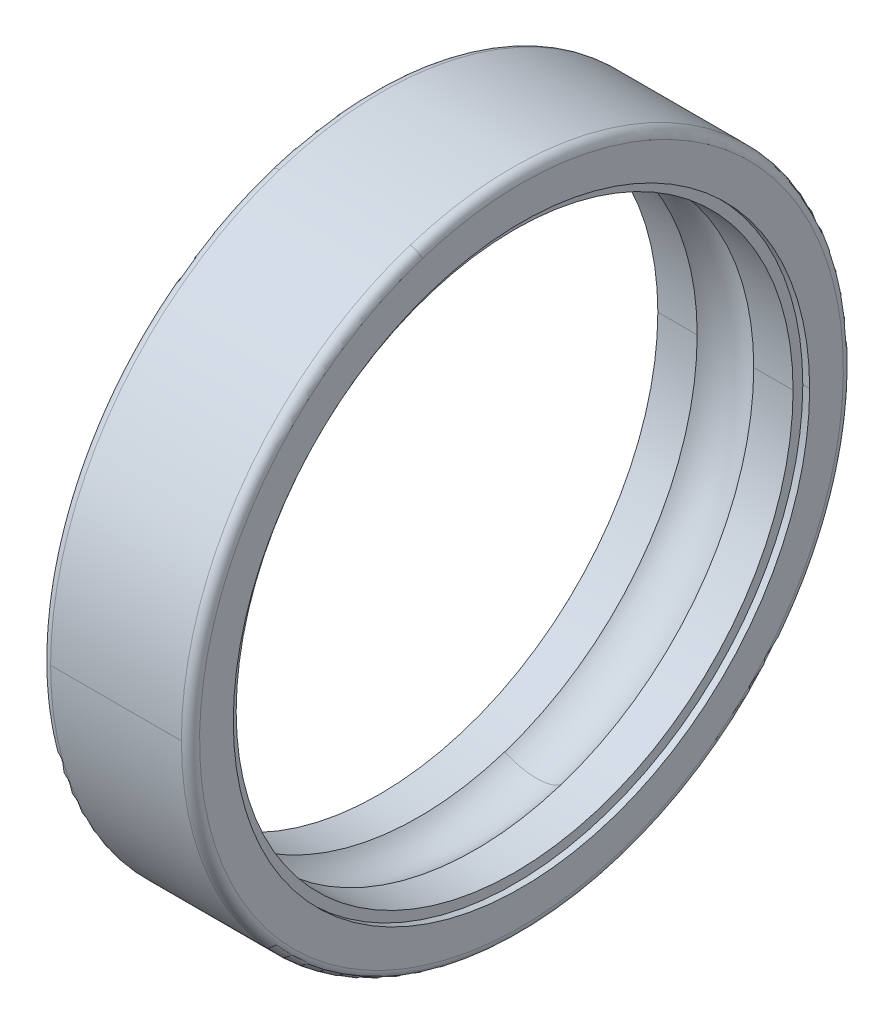
ISO-10303-21;
HEADER;
FILE_DESCRIPTION(('STEP AP214'),'2;1');
FILE_NAME('part.step','',(''),(''),'','','');
FILE_SCHEMA(('AUTOMOTIVE_DESIGN { 1 0 10303 214 1 1 1 1 }'));
ENDSEC;
DATA;
#1=APPLICATION_CONTEXT('core data for automotive mechanical design processes');
#2=APPLICATION_PROTOCOL_DEFINITION('international standard','automotive_design',2000,#1);
#3=PRODUCT_CONTEXT('',#1,'mechanical');
#4=PRODUCT('Part','Part','',(#3));
#5=PRODUCT_RELATED_PRODUCT_CATEGORY('part','',(#4));
#6=PRODUCT_DEFINITION_FORMATION('','',#4);
#7=PRODUCT_DEFINITION_CONTEXT('part definition',#1,'design');
#8=PRODUCT_DEFINITION('design','',#6,#7);
#9=PRODUCT_DEFINITION_SHAPE('','',#8);
#10=(LENGTH_UNIT() NAMED_UNIT(*) SI_UNIT(.MILLI.,.METRE.));
#11=(NAMED_UNIT(*) PLANE_ANGLE_UNIT() SI_UNIT($,.RADIAN.));
#12=(NAMED_UNIT(*) SI_UNIT($,.STERADIAN.) SOLID_ANGLE_UNIT());
#13=UNCERTAINTY_MEASURE_WITH_UNIT(LENGTH_MEASURE(1.E-05),#10,'distance_accuracy_value','');
#14=(GEOMETRIC_REPRESENTATION_CONTEXT(3) GLOBAL_UNCERTAINTY_ASSIGNED_CONTEXT((#13)) GLOBAL_UNIT_ASSIGNED_CONTEXT((#10,
#11,#12)) REPRESENTATION_CONTEXT('',''));
#15=CARTESIAN_POINT('',(0.,0.,0.));
#16=DIRECTION('',(0.,0.,1.));
#17=DIRECTION('',(1.,0.,0.));
#18=AXIS2_PLACEMENT_3D('',#15,#16,#17);
#19=CARTESIAN_POINT('',(0.,38.9,0.));
#20=DIRECTION('',(-1.,0.,0.));
#21=DIRECTION('',(0.,0.,1.));
#22=AXIS2_PLACEMENT_3D('',#19,#20,#21);
#23=PLANE('',#22);
#24=CARTESIAN_POINT('',(0.,0.,0.));
#25=DIRECTION('',(1.,0.,0.));
#26=DIRECTION('',(0.,0.,-1.));
#27=AXIS2_PLACEMENT_3D('',#24,#25,#26);
#28=CIRCLE('',#27,34.825);
#29=CARTESIAN_POINT('',(0.,0.,-34.825));
#30=VERTEX_POINT('',#29);
#31=CARTESIAN_POINT('',(0.,0.,34.825));
#32=VERTEX_POINT('',#31);
#33=EDGE_CURVE('E10',#30,#32,#28,.T.);
#34=ORIENTED_EDGE('',*,*,#33,.T.);
#35=CARTESIAN_POINT('',(0.,0.,0.));
#36=DIRECTION('',(1.,0.,0.));
#37=DIRECTION('',(0.,0.,-1.));
#38=AXIS2_PLACEMENT_3D('',#35,#36,#37);
#39=CIRCLE('',#38,34.825);
#40=EDGE_CURVE('E25',#32,#30,#39,.T.);
#41=ORIENTED_EDGE('',*,*,#40,.T.);
#42=EDGE_LOOP('',(#34,#41));
#43=FACE_BOUND('',#42,.T.);
#44=CARTESIAN_POINT('',(0.,36.9960984838815,12.0207610811854));
#45=CARTESIAN_POINT('',(0.,36.7994218829417,12.626113110637));
#46=CARTESIAN_POINT('',(0.,36.5878629555731,13.2266283711158));
#47=CARTESIAN_POINT('',(0.,36.1355455906681,14.4165597485006));
#48=CARTESIAN_POINT('',(0.,35.8947871531317,15.0059758654065));
#49=CARTESIAN_POINT('',(0.,35.3846359105815,16.1722833500178));
#50=CARTESIAN_POINT('',(0.,35.1152431055675,16.7491747177233));
#51=CARTESIAN_POINT('',(0.,34.5484761021171,17.8890444361661));
#52=CARTESIAN_POINT('',(0.,34.2511019036806,18.4520227869036));
#53=CARTESIAN_POINT('',(0.,33.629087446583,19.5627098015595));
#54=CARTESIAN_POINT('',(0.,33.3044471879219,20.1104184654779));
#55=CARTESIAN_POINT('',(0.,32.6286829831736,21.1892467370559));
#56=CARTESIAN_POINT('',(0.,32.2775590370864,21.7203663447154));
#57=CARTESIAN_POINT('',(0.,31.5496732691986,22.7647369609928));
#58=CARTESIAN_POINT('',(0.,31.1729114473981,23.2779879696105));
#59=CARTESIAN_POINT('',(0.,30.3946576008453,24.2853849289737));
#60=CARTESIAN_POINT('',(0.,29.9931655760931,24.7795308797192));
#61=CARTESIAN_POINT('',(0.,29.1664185475894,25.7475272803691));
#62=CARTESIAN_POINT('',(0.,28.7411635438379,26.2213777302735));
#63=CARTESIAN_POINT('',(0.,27.867915035362,27.1476415825635));
#64=CARTESIAN_POINT('',(0.,27.4199215306375,27.600054984949));
#65=CARTESIAN_POINT('',(0.,26.502275275413,28.482354838538));
#66=CARTESIAN_POINT('',(0.,26.0326225249129,28.9122412897415));
#67=CARTESIAN_POINT('',(0.,25.0727892128557,29.7484516068919));
#68=CARTESIAN_POINT('',(0.,24.5826086512986,30.154775472839));
#69=CARTESIAN_POINT('',(0.,23.5829006050065,30.942881749683));
#70=CARTESIAN_POINT('',(0.,23.0733731202715,31.3246641605799));
#71=CARTESIAN_POINT('',(0.,22.0361987239713,32.0627677800587));
#72=CARTESIAN_POINT('',(0.,21.5085518124061,32.4190889886405));
#73=CARTESIAN_POINT('',(0.,20.4364097100698,33.1054117944866));
#74=CARTESIAN_POINT('',(0.,19.8919145192987,33.4354133917509));
#75=CARTESIAN_POINT('',(0.,18.7873875951579,34.0683019722096));
#76=CARTESIAN_POINT('',(0.,18.2273558617882,34.3711889554041));
#77=CARTESIAN_POINT('',(0.,17.0931050179486,34.9491186264509));
#78=CARTESIAN_POINT('',(0.,16.5188859074788,35.2241613143032));
#79=CARTESIAN_POINT('',(0.,15.3576436535719,35.7457397927398));
#80=CARTESIAN_POINT('',(0.,14.7706205101348,35.992275583324));
#81=CARTESIAN_POINT('',(0.,13.5851843804631,36.4562463409109));
#82=CARTESIAN_POINT('',(0.,12.9867713942284,36.6736813079135));
#83=CARTESIAN_POINT('',(0.,11.77999720826,37.0789265984567));
#84=CARTESIAN_POINT('',(0.,11.1716360085264,37.2667369219972));
#85=CARTESIAN_POINT('',(0.,9.94643099097645,37.6122804740965));
#86=CARTESIAN_POINT('',(0.,9.32958717316014,37.7700137026552));
#87=CARTESIAN_POINT('',(0.,8.08890295023112,38.0550230716275));
#88=CARTESIAN_POINT('',(0.,7.46506254511841,38.182299212041));
#89=CARTESIAN_POINT('',(0.,6.21188803377446,38.4060877853526));
#90=CARTESIAN_POINT('',(0.,5.58255392754323,38.5026002182506));
#91=CARTESIAN_POINT('',(0.,4.31990813494732,38.6646288696267));
#92=CARTESIAN_POINT('',(0.,3.68659644858263,38.7301450881049));
#93=CARTESIAN_POINT('',(0.,2.41752119904381,38.8300234763325));
#94=CARTESIAN_POINT('',(0.,1.78175763586968,38.8643856460819));
#95=CARTESIAN_POINT('',(0.,0.509310242821964,38.9018731553754));
#96=CARTESIAN_POINT('',(0.,-0.127373587051612,38.9049984949194));
#97=CARTESIAN_POINT('',(0.,-1.40012768638514,38.8800048145853));
#98=CARTESIAN_POINT('',(0.,-2.0361979558451,38.8518857947072));
#99=CARTESIAN_POINT('',(0.,-3.30619258535906,38.7644711367107));
#100=CARTESIAN_POINT('',(0.,-3.94011694541307,38.7051754985922));
#101=CARTESIAN_POINT('',(0.,-5.20429257680657,38.555550452501));
#102=CARTESIAN_POINT('',(0.,-5.83454384814606,38.4652210445282));
#103=CARTESIAN_POINT('',(0.,-7.08985497159437,38.253746070184));
#104=CARTESIAN_POINT('',(0.,-7.71491482370319,38.1326005038125));
#105=CARTESIAN_POINT('',(0.,-8.95833728475763,37.8597850629514));
#106=CARTESIAN_POINT('',(0.,-9.57669989370326,37.7081151884618));
#107=CARTESIAN_POINT('',(0.,-10.8052381787442,37.3746165173767));
#108=CARTESIAN_POINT('',(0.,-11.4154138548396,37.1927877207812));
#109=CARTESIAN_POINT('',(0.,-12.6261083075312,36.7994092469818));
#110=CARTESIAN_POINT('',(0.,-13.2266270841274,36.5878595697778));
#111=CARTESIAN_POINT('',(0.,-14.4165610354888,36.1355489764634));
#112=CARTESIAN_POINT('',(0.,-15.0059762102539,35.8947880603529));
#113=CARTESIAN_POINT('',(0.,-16.1722830051703,35.3846350033604));
#114=CARTESIAN_POINT('',(0.,-16.7491746253216,35.1152428624784));
#115=CARTESIAN_POINT('',(0.,-17.8890445285677,34.5484763452063));
#116=CARTESIAN_POINT('',(0.,-18.4520228116625,34.2511019688162));
#117=CARTESIAN_POINT('',(0.,-19.5627097768005,33.6290873814475));
#118=CARTESIAN_POINT('',(0.,-20.1104184588437,33.3044471704689));
#119=CARTESIAN_POINT('',(0.,-21.18924674369,32.6286830006266));
#120=CARTESIAN_POINT('',(0.,-21.720366346493,32.2775590417629));
#121=CARTESIAN_POINT('',(0.,-22.7647369592151,31.5496732645221));
#122=CARTESIAN_POINT('',(0.,-23.2779879691342,31.1729114461451));
#123=CARTESIAN_POINT('',(0.,-24.28538492945,30.3946576020984));
#124=CARTESIAN_POINT('',(0.,-24.7795308798468,29.9931655764289));
#125=CARTESIAN_POINT('',(0.,-25.7475272802414,29.1664185472537));
#126=CARTESIAN_POINT('',(0.,-26.2213777302392,28.741163543748));
#127=CARTESIAN_POINT('',(0.,-27.1476415825976,27.867915035452));
#128=CARTESIAN_POINT('',(0.,-27.6000549849581,27.4199215306617));
#129=CARTESIAN_POINT('',(0.,-28.4823548385288,26.5022752753889));
#130=CARTESIAN_POINT('',(0.,-28.912241289739,26.0326225249065));
#131=CARTESIAN_POINT('',(0.,-29.7484516068943,25.0727892128622));
#132=CARTESIAN_POINT('',(0.,-30.1547754728396,24.5826086513004));
#133=CARTESIAN_POINT('',(0.,-30.9428817496823,23.5829006050048));
#134=CARTESIAN_POINT('',(0.,-31.3246641605797,23.0733731202711));
#135=CARTESIAN_POINT('',(0.,-32.0627677800588,22.0361987239718));
#136=CARTESIAN_POINT('',(0.,-32.4190889886405,21.5085518124063));
#137=CARTESIAN_POINT('',(0.,-33.1054117944865,20.4364097100697));
#138=CARTESIAN_POINT('',(0.,-33.4354133917508,19.8919145192987));
#139=CARTESIAN_POINT('',(0.,-34.0683019722096,18.787387595158));
#140=CARTESIAN_POINT('',(0.,-34.3711889554041,18.2273558617882));
#141=CARTESIAN_POINT('',(0.,-34.9491186264508,17.0931050179487));
#142=CARTESIAN_POINT('',(0.,-35.2241613143031,16.5188859074789));
#143=CARTESIAN_POINT('',(0.,-35.7457397927398,15.357643653572));
#144=CARTESIAN_POINT('',(0.,-35.9922755833241,14.7706205101349));
#145=CARTESIAN_POINT('',(0.,-36.4562463409107,13.5851843804632));
#146=CARTESIAN_POINT('',(0.,-36.673681307913,12.9867713942286));
#147=CARTESIAN_POINT('',(0.,-37.0789265984572,11.77999720826));
#148=CARTESIAN_POINT('',(0.,-37.266736921999,11.171636008526));
#149=CARTESIAN_POINT('',(0.,-37.6122804740947,9.94643099097701));
#150=CARTESIAN_POINT('',(0.,-37.7700137026485,9.32958717316204));
#151=CARTESIAN_POINT('',(0.,-38.0550230716341,8.0889029502294));
#152=CARTESIAN_POINT('',(0.,-38.1822992120659,7.46506254511173));
#153=CARTESIAN_POINT('',(0.,-38.4060877853276,6.2118880337813));
#154=CARTESIAN_POINT('',(0.,-38.5026002181577,5.58255392756854));
#155=CARTESIAN_POINT('',(0.,-38.6646288697196,4.3199081349222));
#156=CARTESIAN_POINT('',(0.,-38.7301450884515,3.68659644848861));
#157=CARTESIAN_POINT('',(0.,-38.8300234759858,2.41752119913799));
#158=CARTESIAN_POINT('',(0.,-38.8643856447882,1.78175763622095));
#159=CARTESIAN_POINT('',(0.,-38.9018731566691,0.509310242470852));
#160=CARTESIAN_POINT('',(0.,-38.9049984997476,-0.127373588362207));
#161=CARTESIAN_POINT('',(0.,-38.880004809757,-1.40012768507439));
#162=CARTESIAN_POINT('',(0.,-38.8518857766879,-2.03619795095351));
#163=CARTESIAN_POINT('',(0.,-38.7644711547299,-3.30619259025047));
#164=CARTESIAN_POINT('',(0.,-38.7051755658409,-3.9401169636683));
#165=CARTESIAN_POINT('',(0.,-38.5555503852523,-5.20429255855116));
#166=CARTESIAN_POINT('',(0.,-38.4652207935527,-5.8345437800162));
#167=CARTESIAN_POINT('',(0.,-38.2537463211595,-7.08985503972402));
#168=CARTESIAN_POINT('',(0.,-38.1326014404661,-7.7149150779668));
#169=CARTESIAN_POINT('',(0.,-37.8597841262979,-8.95833703049381));
#170=CARTESIAN_POINT('',(0.,-37.7081116928231,-9.57669894477805));
#171=CARTESIAN_POINT('',(0.,-37.3746200130153,-10.8052391276693));
#172=CARTESIAN_POINT('',(0.,-37.1928007666823,-11.4154173962763));
#173=CARTESIAN_POINT('',(0.,-36.9960984838815,-12.0207610811853));
#174=B_SPLINE_CURVE_WITH_KNOTS('',3,(#44,#45,#46,#47,#48,#49,#50,#51,#52,#53,#54,#55,#56,#57,
#58,#59,#60,#61,#62,#63,#64,#65,#66,#67,#68,#69,#70,#71,#72,#73,#74,#75,#76,#77,#78,#79,#80,#81,
#82,#83,#84,#85,#86,#87,#88,#89,#90,#91,#92,#93,#94,#95,#96,#97,#98,#99,#100,#101,#102,#103,
#104,#105,#106,#107,#108,#109,#110,#111,#112,#113,#114,#115,#116,#117,#118,#119,#120,#121,#122,
#123,#124,#125,#126,#127,#128,#129,#130,#131,#132,#133,#134,#135,#136,#137,#138,#139,#140,#141,
#142,#143,#144,#145,#146,#147,#148,#149,#150,#151,#152,#153,#154,#155,#156,#157,#158,#159,#160,
#161,#162,#163,#164,#165,#166,#167,#168,#169,#170,#171,#172,#173),.UNSPECIFIED.,.F.,.F.,(4,2,2,
2,2,2,2,2,2,2,2,2,2,2,2,2,2,2,2,2,2,2,2,2,2,2,2,2,2,2,2,2,2,2,2,2,2,2,2,2,2,2,2,2,2,2,2,2,2,2,2,
2,2,2,2,2,2,2,2,2,2,2,2,2,4),(0.,1.90930757908258,3.81861515816515,5.72792273724772,
7.6372303163303,9.54653789541286,11.4558454744954,13.365153053578,15.2744606326606,
17.1837682117432,19.0930757908257,21.0023833699083,22.9116909489909,24.8209985280734,
26.730306107156,28.6396136862386,30.5489212653212,32.4582288444038,34.3675364234863,
36.2768440025689,38.1861515816515,40.0954591607341,42.0047667398166,43.9140743188992,
45.8233818979818,47.7326894770644,49.6419970561469,51.5513046352295,53.4606122143121,
55.3699197933947,57.2792273724772,59.1885349515598,61.0978425306424,63.0071501097249,
64.9164576888075,66.82576526789,68.7350728469726,70.6443804260552,72.5536880051378,
74.4629955842204,76.3723031633029,78.2816107423855,80.1909183214681,82.1002259005507,
84.0095334796332,85.9188410587158,87.8281486377984,89.7374562168809,91.6467637959635,
93.5560713750461,95.4653789541287,97.3746865332112,99.2839941122938,101.193301691376,
103.102609270459,105.011916849541,106.921224428624,108.830532007707,110.739839586789,
112.649147165872,114.558454744954,116.467762324037,118.37706990312,120.286377482202,
122.195685061285),.UNSPECIFIED.);
#175=CARTESIAN_POINT('',(0.,36.9960984838815,12.0207610811855));
#176=VERTEX_POINT('',#175);
#177=CARTESIAN_POINT('',(0.,-36.9960984838815,-12.0207610811854));
#178=VERTEX_POINT('',#177);
#179=EDGE_CURVE('E318',#176,#178,#174,.T.);
#180=ORIENTED_EDGE('',*,*,#179,.F.);
#181=CARTESIAN_POINT('',(0.,-36.9960984838815,-12.0207610811854));
#182=CARTESIAN_POINT('',(0.,-36.7994218829417,-12.6261131106369));
#183=CARTESIAN_POINT('',(0.,-36.5878629555731,-13.2266283711158));
#184=CARTESIAN_POINT('',(0.,-36.1355455906681,-14.4165597485006));
#185=CARTESIAN_POINT('',(0.,-35.8947871531317,-15.0059758654065));
#186=CARTESIAN_POINT('',(0.,-35.3846359105815,-16.1722833500178));
#187=CARTESIAN_POINT('',(0.,-35.1152431055675,-16.7491747177233));
#188=CARTESIAN_POINT('',(0.,-34.5484761021171,-17.8890444361661));
#189=CARTESIAN_POINT('',(0.,-34.2511019036806,-18.4520227869036));
#190=CARTESIAN_POINT('',(0.,-33.629087446583,-19.5627098015595));
#191=CARTESIAN_POINT('',(0.,-33.3044471879219,-20.1104184654779));
#192=CARTESIAN_POINT('',(0.,-32.6286829831736,-21.1892467370559));
#193=CARTESIAN_POINT('',(0.,-32.2775590370864,-21.7203663447154));
#194=CARTESIAN_POINT('',(0.,-31.5496732691986,-22.7647369609928));
#195=CARTESIAN_POINT('',(0.,-31.1729114473981,-23.2779879696105));
#196=CARTESIAN_POINT('',(0.,-30.3946576008453,-24.2853849289737));
#197=CARTESIAN_POINT('',(0.,-29.9931655760931,-24.7795308797192));
#198=CARTESIAN_POINT('',(0.,-29.1664185475894,-25.7475272803691));
#199=CARTESIAN_POINT('',(0.,-28.741163543838,-26.2213777302735));
#200=CARTESIAN_POINT('',(0.,-27.867915035362,-27.1476415825635));
#201=CARTESIAN_POINT('',(0.,-27.4199215306375,-27.600054984949));
#202=CARTESIAN_POINT('',(0.,-26.502275275413,-28.482354838538));
#203=CARTESIAN_POINT('',(0.,-26.0326225249129,-28.9122412897415));
#204=CARTESIAN_POINT('',(0.,-25.0727892128558,-29.7484516068919));
#205=CARTESIAN_POINT('',(0.,-24.5826086512986,-30.1547754728389));
#206=CARTESIAN_POINT('',(0.,-23.5829006050065,-30.9428817496829));
#207=CARTESIAN_POINT('',(0.,-23.0733731202715,-31.3246641605799));
#208=CARTESIAN_POINT('',(0.,-22.0361987239713,-32.0627677800587));
#209=CARTESIAN_POINT('',(0.,-21.5085518124061,-32.4190889886405));
#210=CARTESIAN_POINT('',(0.,-20.4364097100698,-33.1054117944866));
#211=CARTESIAN_POINT('',(0.,-19.8919145192987,-33.4354133917508));
#212=CARTESIAN_POINT('',(0.,-18.7873875951579,-34.0683019722096));
#213=CARTESIAN_POINT('',(0.,-18.2273558617882,-34.3711889554041));
#214=CARTESIAN_POINT('',(0.,-17.0931050179487,-34.9491186264509));
#215=CARTESIAN_POINT('',(0.,-16.5188859074789,-35.2241613143032));
#216=CARTESIAN_POINT('',(0.,-15.357643653572,-35.7457397927397));
#217=CARTESIAN_POINT('',(0.,-14.7706205101349,-35.992275583324));
#218=CARTESIAN_POINT('',(0.,-13.5851843804631,-36.4562463409109));
#219=CARTESIAN_POINT('',(0.,-12.9867713942284,-36.6736813079135));
#220=CARTESIAN_POINT('',(0.,-11.7799972082601,-37.0789265984567));
#221=CARTESIAN_POINT('',(0.,-11.1716360085264,-37.2667369219972));
#222=CARTESIAN_POINT('',(0.,-9.94643099097649,-37.6122804740965));
#223=CARTESIAN_POINT('',(0.,-9.32958717316018,-37.7700137026552));
#224=CARTESIAN_POINT('',(0.,-8.08890295023116,-38.0550230716275));
#225=CARTESIAN_POINT('',(0.,-7.46506254511845,-38.182299212041));
#226=CARTESIAN_POINT('',(0.,-6.21188803377451,-38.4060877853525));
#227=CARTESIAN_POINT('',(0.,-5.58255392754328,-38.5026002182506));
#228=CARTESIAN_POINT('',(0.,-4.31990813494736,-38.6646288696267));
#229=CARTESIAN_POINT('',(0.,-3.68659644858267,-38.7301450881049));
#230=CARTESIAN_POINT('',(0.,-2.41752119904384,-38.8300234763325));
#231=CARTESIAN_POINT('',(0.,-1.78175763586971,-38.8643856460819));
#232=CARTESIAN_POINT('',(0.,-0.509310242821988,-38.9018731553754));
#233=CARTESIAN_POINT('',(0.,0.127373587051592,-38.9049984949194));
#234=CARTESIAN_POINT('',(0.,1.40012768638512,-38.8800048145853));
#235=CARTESIAN_POINT('',(0.,2.03619795584506,-38.8518857947072));
#236=CARTESIAN_POINT('',(0.,3.30619258535901,-38.7644711367107));
#237=CARTESIAN_POINT('',(0.,3.94011694541302,-38.7051754985922));
#238=CARTESIAN_POINT('',(0.,5.20429257680652,-38.555550452501));
#239=CARTESIAN_POINT('',(0.,5.83454384814601,-38.4652210445282));
#240=CARTESIAN_POINT('',(0.,7.08985497159431,-38.253746070184));
#241=CARTESIAN_POINT('',(0.,7.71491482370313,-38.1326005038125));
#242=CARTESIAN_POINT('',(0.,8.95833728475759,-37.8597850629514));
#243=CARTESIAN_POINT('',(0.,9.57669989370322,-37.7081151884618));
#244=CARTESIAN_POINT('',(0.,10.8052381787442,-37.3746165173767));
#245=CARTESIAN_POINT('',(0.,11.4154138548395,-37.1927877207812));
#246=CARTESIAN_POINT('',(0.,12.6261083075311,-36.7994092469818));
#247=CARTESIAN_POINT('',(0.,13.2266270841274,-36.5878595697778));
#248=CARTESIAN_POINT('',(0.,14.4165610354888,-36.1355489764634));
#249=CARTESIAN_POINT('',(0.,15.0059762102539,-35.8947880603529));
#250=CARTESIAN_POINT('',(0.,16.1722830051703,-35.3846350033604));
#251=CARTESIAN_POINT('',(0.,16.7491746253216,-35.1152428624784));
#252=CARTESIAN_POINT('',(0.,17.8890445285676,-34.5484763452063));
#253=CARTESIAN_POINT('',(0.,18.4520228116624,-34.2511019688162));
#254=CARTESIAN_POINT('',(0.,19.5627097768004,-33.6290873814475));
#255=CARTESIAN_POINT('',(0.,20.1104184588437,-33.3044471704689));
#256=CARTESIAN_POINT('',(0.,21.1892467436899,-32.6286830006266));
#257=CARTESIAN_POINT('',(0.,21.7203663464929,-32.2775590417629));
#258=CARTESIAN_POINT('',(0.,22.7647369592151,-31.5496732645222));
#259=CARTESIAN_POINT('',(0.,23.2779879691341,-31.1729114461451));
#260=CARTESIAN_POINT('',(0.,24.28538492945,-30.3946576020984));
#261=CARTESIAN_POINT('',(0.,24.7795308798467,-29.9931655764289));
#262=CARTESIAN_POINT('',(0.,25.7475272802413,-29.1664185472537));
#263=CARTESIAN_POINT('',(0.,26.2213777302392,-28.7411635437481));
#264=CARTESIAN_POINT('',(0.,27.1476415825976,-27.8679150354521));
#265=CARTESIAN_POINT('',(0.,27.6000549849581,-27.4199215306617));
#266=CARTESIAN_POINT('',(0.,28.4823548385288,-26.502275275389));
#267=CARTESIAN_POINT('',(0.,28.9122412897389,-26.0326225249066));
#268=CARTESIAN_POINT('',(0.,29.7484516068943,-25.0727892128623));
#269=CARTESIAN_POINT('',(0.,30.1547754728395,-24.5826086513005));
#270=CARTESIAN_POINT('',(0.,30.9428817496822,-23.5829006050049));
#271=CARTESIAN_POINT('',(0.,31.3246641605797,-23.0733731202712));
#272=CARTESIAN_POINT('',(0.,32.0627677800588,-22.0361987239719));
#273=CARTESIAN_POINT('',(0.,32.4190889886404,-21.5085518124063));
#274=CARTESIAN_POINT('',(0.,33.1054117944864,-20.4364097100698));
#275=CARTESIAN_POINT('',(0.,33.4354133917508,-19.8919145192988));
#276=CARTESIAN_POINT('',(0.,34.0683019722096,-18.787387595158));
#277=CARTESIAN_POINT('',(0.,34.371188955404,-18.2273558617883));
#278=CARTESIAN_POINT('',(0.,34.9491186264508,-17.0931050179488));
#279=CARTESIAN_POINT('',(0.,35.2241613143031,-16.518885907479));
#280=CARTESIAN_POINT('',(0.,35.7457397927397,-15.357643653572));
#281=CARTESIAN_POINT('',(0.,35.9922755833241,-14.7706205101349));
#282=CARTESIAN_POINT('',(0.,36.4562463409107,-13.5851843804632));
#283=CARTESIAN_POINT('',(0.,36.673681307913,-12.9867713942286));
#284=CARTESIAN_POINT('',(0.,37.0789265984572,-11.7799972082601));
#285=CARTESIAN_POINT('',(0.,37.266736921999,-11.1716360085261));
#286=CARTESIAN_POINT('',(0.,37.6122804740947,-9.94643099097708));
#287=CARTESIAN_POINT('',(0.,37.7700137026485,-9.32958717316209));
#288=CARTESIAN_POINT('',(0.,38.0550230716341,-8.08890295022946));
#289=CARTESIAN_POINT('',(0.,38.1822992120659,-7.4650625451118));
#290=CARTESIAN_POINT('',(0.,38.4060877853276,-6.21188803378137));
#291=CARTESIAN_POINT('',(0.,38.5026002181577,-5.5825539275686));
#292=CARTESIAN_POINT('',(0.,38.6646288697196,-4.31990813492225));
#293=CARTESIAN_POINT('',(0.,38.7301450884515,-3.68659644848868));
#294=CARTESIAN_POINT('',(0.,38.8300234759858,-2.41752119913807));
#295=CARTESIAN_POINT('',(0.,38.8643856447882,-1.78175763622103));
#296=CARTESIAN_POINT('',(0.,38.9018731566691,-0.509310242470937));
#297=CARTESIAN_POINT('',(0.,38.9049984997476,0.127373588362122));
#298=CARTESIAN_POINT('',(0.,38.880004809757,1.40012768507431));
#299=CARTESIAN_POINT('',(0.,38.8518857766879,2.03619795095343));
#300=CARTESIAN_POINT('',(0.,38.7644711547299,3.30619259025038));
#301=CARTESIAN_POINT('',(0.,38.705175565841,3.94011696366821));
#302=CARTESIAN_POINT('',(0.,38.5555503852523,5.20429255855109));
#303=CARTESIAN_POINT('',(0.,38.4652207935527,5.83454378001615));
#304=CARTESIAN_POINT('',(0.,38.2537463211596,7.08985503972398));
#305=CARTESIAN_POINT('',(0.,38.1326014404661,7.71491507796675));
#306=CARTESIAN_POINT('',(0.,37.8597841262979,8.95833703049376));
#307=CARTESIAN_POINT('',(0.,37.7081116928231,9.576698944778));
#308=CARTESIAN_POINT('',(0.,37.3746200130154,10.8052391276692));
#309=CARTESIAN_POINT('',(0.,37.1928007666823,11.4154173962762));
#310=CARTESIAN_POINT('',(0.,36.9960984838815,12.0207610811852));
#311=B_SPLINE_CURVE_WITH_KNOTS('',3,(#181,#182,#183,#184,#185,#186,#187,#188,#189,#190,#191,
#192,#193,#194,#195,#196,#197,#198,#199,#200,#201,#202,#203,#204,#205,#206,#207,#208,#209,#210,
#211,#212,#213,#214,#215,#216,#217,#218,#219,#220,#221,#222,#223,#224,#225,#226,#227,#228,#229,
#230,#231,#232,#233,#234,#235,#236,#237,#238,#239,#240,#241,#242,#243,#244,#245,#246,#247,#248,
#249,#250,#251,#252,#253,#254,#255,#256,#257,#258,#259,#260,#261,#262,#263,#264,#265,#266,#267,
#268,#269,#270,#271,#272,#273,#274,#275,#276,#277,#278,#279,#280,#281,#282,#283,#284,#285,#286,
#287,#288,#289,#290,#291,#292,#293,#294,#295,#296,#297,#298,#299,#300,#301,#302,#303,#304,#305,
#306,#307,#308,#309,#310),.UNSPECIFIED.,.F.,.F.,(4,2,2,2,2,2,2,2,2,2,2,2,2,2,2,2,2,2,2,2,2,2,2,
2,2,2,2,2,2,2,2,2,2,2,2,2,2,2,2,2,2,2,2,2,2,2,2,2,2,2,2,2,2,2,2,2,2,2,2,2,2,2,2,2,4),(0.,
1.90930757908258,3.81861515816515,5.72792273724772,7.63723031633029,9.54653789541286,
11.4558454744954,13.365153053578,15.2744606326606,17.1837682117432,19.0930757908257,
21.0023833699083,22.9116909489909,24.8209985280735,26.730306107156,28.6396136862386,
30.5489212653212,32.4582288444037,34.3675364234863,36.2768440025689,38.1861515816515,
40.095459160734,42.0047667398166,43.9140743188992,45.8233818979818,47.7326894770643,
49.6419970561469,51.5513046352295,53.460612214312,55.3699197933946,57.2792273724772,
59.1885349515597,61.0978425306423,63.0071501097249,64.9164576888075,66.82576526789,
68.7350728469726,70.6443804260552,72.5536880051378,74.4629955842203,76.3723031633029,
78.2816107423855,80.190918321468,82.1002259005506,84.0095334796332,85.9188410587158,
87.8281486377983,89.7374562168809,91.6467637959635,93.5560713750461,95.4653789541286,
97.3746865332112,99.2839941122938,101.193301691376,103.102609270459,105.011916849541,
106.921224428624,108.830532007707,110.739839586789,112.649147165872,114.558454744954,
116.467762324037,118.37706990312,120.286377482202,122.195685061285),.UNSPECIFIED.);
#312=EDGE_CURVE('E419',#178,#176,#311,.T.);
#313=ORIENTED_EDGE('',*,*,#312,.F.);
#314=EDGE_LOOP('',(#180,#313));
#315=FACE_BOUND('',#314,.T.);
#316=ADVANCED_FACE('F16',(#43,#315),#23,.T.);
#317=CARTESIAN_POINT('',(1.10000000000035,0.,0.));
#318=DIRECTION('',(1.,0.,0.));
#319=DIRECTION('',(0.,-0.309016994374947,0.951056516295154));
#320=AXIS2_PLACEMENT_3D('',#317,#318,#319);
#321=TOROIDAL_SURFACE('',#320,38.9,1.10000000000034);
#322=CARTESIAN_POINT('',(1.10000000000035,-36.9960984838815,-12.0207610811854));
#323=DIRECTION('',(0.,0.309016994374947,-0.951056516295154));
#324=DIRECTION('',(-3.17523785042695E-13,-0.951056516295154,-0.309016994374947));
#325=AXIS2_PLACEMENT_3D('',#322,#323,#324);
#326=CIRCLE('',#325,1.10000000000034);
#327=CARTESIAN_POINT('',(1.1,-38.0422606518065,-12.360679774998));
#328=VERTEX_POINT('',#327);
#329=EDGE_CURVE('E382',#328,#178,#326,.T.);
#330=ORIENTED_EDGE('',*,*,#329,.T.);
#331=ORIENTED_EDGE('',*,*,#312,.T.);
#332=CARTESIAN_POINT('',(1.10000000000035,36.9960984838815,12.0207610811855));
#333=DIRECTION('',(0.,-0.309016994374947,0.951056516295154));
#334=DIRECTION('',(-3.16716350115695E-13,0.951056516295154,0.309016994374947));
#335=AXIS2_PLACEMENT_3D('',#332,#333,#334);
#336=CIRCLE('',#335,1.10000000000034);
#337=CARTESIAN_POINT('',(1.1,38.0422606518065,12.360679774998));
#338=VERTEX_POINT('',#337);
#339=EDGE_CURVE('E378',#338,#176,#336,.T.);
#340=ORIENTED_EDGE('',*,*,#339,.F.);
#341=CARTESIAN_POINT('',(1.1,0.,0.));
#342=DIRECTION('',(1.,0.,0.));
#343=DIRECTION('',(0.,0.,-1.));
#344=AXIS2_PLACEMENT_3D('',#341,#342,#343);
#345=CIRCLE('',#344,40.);
#346=CARTESIAN_POINT('',(1.1,0.,-40.));
#347=VERTEX_POINT('',#346);
#348=EDGE_CURVE('E373',#347,#338,#345,.T.);
#349=ORIENTED_EDGE('',*,*,#348,.F.);
#350=CARTESIAN_POINT('',(1.1,0.,0.));
#351=DIRECTION('',(1.,0.,0.));
#352=DIRECTION('',(0.,0.,-1.));
#353=AXIS2_PLACEMENT_3D('',#350,#351,#352);
#354=CIRCLE('',#353,40.);
#355=EDGE_CURVE('E368',#328,#347,#354,.T.);
#356=ORIENTED_EDGE('',*,*,#355,.F.);
#357=EDGE_LOOP('',(#330,#331,#340,#349,#356));
#358=FACE_BOUND('',#357,.T.);
#359=ADVANCED_FACE('F390',(#358),#321,.T.);
#360=CARTESIAN_POINT('',(18.,0.,0.));
#361=DIRECTION('',(1.,0.,0.));
#362=DIRECTION('',(0.,1.,0.));
#363=AXIS2_PLACEMENT_3D('',#360,#361,#362);
#364=CYLINDRICAL_SURFACE('',#363,40.);
#365=DIRECTION('',(1.,0.,0.));
#366=VECTOR('',#365,1.);
#367=CARTESIAN_POINT('',(1.1,0.,40.));
#368=LINE('',#367,#366);
#369=CARTESIAN_POINT('',(1.1,0.,40.));
#370=VERTEX_POINT('',#369);
#371=CARTESIAN_POINT('',(16.9,0.,40.));
#372=VERTEX_POINT('',#371);
#373=EDGE_CURVE('E363',#370,#372,#368,.T.);
#374=ORIENTED_EDGE('',*,*,#373,.F.);
#375=CARTESIAN_POINT('',(1.1,0.,0.));
#376=DIRECTION('',(1.,0.,0.));
#377=DIRECTION('',(0.,0.,-1.));
#378=AXIS2_PLACEMENT_3D('',#375,#376,#377);
#379=CIRCLE('',#378,40.);
#380=EDGE_CURVE('E358',#370,#328,#379,.T.);
#381=ORIENTED_EDGE('',*,*,#380,.T.);
#382=ORIENTED_EDGE('',*,*,#355,.T.);
#383=DIRECTION('',(1.,0.,0.));
#384=VECTOR('',#383,1.);
#385=CARTESIAN_POINT('',(1.1,0.,-40.));
#386=LINE('',#385,#384);
#387=CARTESIAN_POINT('',(16.9,0.,-40.));
#388=VERTEX_POINT('',#387);
#389=EDGE_CURVE('E354',#347,#388,#386,.T.);
#390=ORIENTED_EDGE('',*,*,#389,.T.);
#391=CARTESIAN_POINT('',(16.9,0.,0.));
#392=DIRECTION('',(1.,0.,0.));
#393=DIRECTION('',(0.,0.,-1.));
#394=AXIS2_PLACEMENT_3D('',#391,#392,#393);
#395=CIRCLE('',#394,40.);
#396=CARTESIAN_POINT('',(16.9,-38.0422606518061,-12.3606797749979));
#397=VERTEX_POINT('',#396);
#398=EDGE_CURVE('E349',#397,#388,#395,.T.);
#399=ORIENTED_EDGE('',*,*,#398,.F.);
#400=CARTESIAN_POINT('',(16.9,0.,0.));
#401=DIRECTION('',(1.,0.,0.));
#402=DIRECTION('',(0.,0.,-1.));
#403=AXIS2_PLACEMENT_3D('',#400,#401,#402);
#404=CIRCLE('',#403,40.);
#405=EDGE_CURVE('E344',#372,#397,#404,.T.);
#406=ORIENTED_EDGE('',*,*,#405,.F.);
#407=EDGE_LOOP('',(#374,#381,#382,#390,#399,#406));
#408=FACE_BOUND('',#407,.T.);
#409=ADVANCED_FACE('F399',(#408),#364,.T.);
#410=CARTESIAN_POINT('',(16.8999999999993,0.,0.));
#411=DIRECTION('',(1.,0.,0.));
#412=DIRECTION('',(0.,0.309016994374947,-0.951056516295154));
#413=AXIS2_PLACEMENT_3D('',#410,#411,#412);
#414=TOROIDAL_SURFACE('',#413,38.8999999999993,1.10000000000069);
#415=CARTESIAN_POINT('',(16.8999999999993,-36.9960984838808,-12.0207610811852));
#416=DIRECTION('',(0.,0.309016994374947,-0.951056516295154));
#417=DIRECTION('',(1.,0.,0.));
#418=AXIS2_PLACEMENT_3D('',#415,#416,#417);
#419=CIRCLE('',#418,1.10000000000069);
#420=CARTESIAN_POINT('',(18.,-36.9960984838808,-12.0207610811852));
#421=VERTEX_POINT('',#420);
#422=EDGE_CURVE('E340',#421,#397,#419,.T.);
#423=ORIENTED_EDGE('',*,*,#422,.F.);
#424=CARTESIAN_POINT('',(18.,0.,0.));
#425=DIRECTION('',(1.,0.,0.));
#426=DIRECTION('',(0.,0.,-1.));
#427=AXIS2_PLACEMENT_3D('',#424,#425,#426);
#428=CIRCLE('',#427,38.9);
#429=CARTESIAN_POINT('',(18.,36.9960984838808,12.0207610811852));
#430=VERTEX_POINT('',#429);
#431=EDGE_CURVE('E336',#430,#421,#428,.T.);
#432=ORIENTED_EDGE('',*,*,#431,.F.);
#433=CARTESIAN_POINT('',(16.8999999999993,36.9960984838808,12.0207610811852));
#434=DIRECTION('',(0.,-0.309016994374947,0.951056516295154));
#435=DIRECTION('',(1.,0.,0.));
#436=AXIS2_PLACEMENT_3D('',#433,#434,#435);
#437=CIRCLE('',#436,1.10000000000069);
#438=CARTESIAN_POINT('',(16.9,38.0422606518061,12.3606797749979));
#439=VERTEX_POINT('',#438);
#440=EDGE_CURVE('E332',#430,#439,#437,.T.);
#441=ORIENTED_EDGE('',*,*,#440,.T.);
#442=CARTESIAN_POINT('',(16.9,0.,0.));
#443=DIRECTION('',(1.,0.,0.));
#444=DIRECTION('',(0.,0.,-1.));
#445=AXIS2_PLACEMENT_3D('',#442,#443,#444);
#446=CIRCLE('',#445,40.);
#447=EDGE_CURVE('E327',#439,#372,#446,.T.);
#448=ORIENTED_EDGE('',*,*,#447,.T.);
#449=ORIENTED_EDGE('',*,*,#405,.T.);
#450=EDGE_LOOP('',(#423,#432,#441,#448,#449));
#451=FACE_BOUND('',#450,.T.);
#452=ADVANCED_FACE('F403',(#451),#414,.T.);
#453=CARTESIAN_POINT('',(18.,0.,0.));
#454=DIRECTION('',(1.,0.,0.));
#455=DIRECTION('',(0.,-1.,0.));
#456=AXIS2_PLACEMENT_3D('',#453,#454,#455);
#457=CYLINDRICAL_SURFACE('',#456,40.);
#458=ORIENTED_EDGE('',*,*,#373,.T.);
#459=ORIENTED_EDGE('',*,*,#447,.F.);
#460=CARTESIAN_POINT('',(16.9,0.,0.));
#461=DIRECTION('',(1.,0.,0.));
#462=DIRECTION('',(0.,0.,-1.));
#463=AXIS2_PLACEMENT_3D('',#460,#461,#462);
#464=CIRCLE('',#463,40.);
#465=EDGE_CURVE('E322',#388,#439,#464,.T.);
#466=ORIENTED_EDGE('',*,*,#465,.F.);
#467=ORIENTED_EDGE('',*,*,#389,.F.);
#468=ORIENTED_EDGE('',*,*,#348,.T.);
#469=CARTESIAN_POINT('',(1.1,0.,0.));
#470=DIRECTION('',(1.,0.,0.));
#471=DIRECTION('',(0.,0.,-1.));
#472=AXIS2_PLACEMENT_3D('',#469,#470,#471);
#473=CIRCLE('',#472,40.);
#474=EDGE_CURVE('E319',#338,#370,#473,.T.);
#475=ORIENTED_EDGE('',*,*,#474,.T.);
#476=EDGE_LOOP('',(#458,#459,#466,#467,#468,#475));
#477=FACE_BOUND('',#476,.T.);
#478=ADVANCED_FACE('F406',(#477),#457,.T.);
#479=CARTESIAN_POINT('',(1.10000000000035,0.,0.));
#480=DIRECTION('',(1.,0.,0.));
#481=DIRECTION('',(0.,0.309016994374947,-0.951056516295154));
#482=AXIS2_PLACEMENT_3D('',#479,#480,#481);
#483=TOROIDAL_SURFACE('',#482,38.9,1.10000000000034);
#484=ORIENTED_EDGE('',*,*,#329,.F.);
#485=ORIENTED_EDGE('',*,*,#380,.F.);
#486=ORIENTED_EDGE('',*,*,#474,.F.);
#487=ORIENTED_EDGE('',*,*,#339,.T.);
#488=ORIENTED_EDGE('',*,*,#179,.T.);
#489=EDGE_LOOP('',(#484,#485,#486,#487,#488));
#490=FACE_BOUND('',#489,.T.);
#491=ADVANCED_FACE('F288',(#490),#483,.T.);
#492=CARTESIAN_POINT('',(16.8999999999993,0.,0.));
#493=DIRECTION('',(1.,0.,0.));
#494=DIRECTION('',(0.,-0.309016994374947,0.951056516295154));
#495=AXIS2_PLACEMENT_3D('',#492,#493,#494);
#496=TOROIDAL_SURFACE('',#495,38.8999999999993,1.10000000000069);
#497=ORIENTED_EDGE('',*,*,#422,.T.);
#498=ORIENTED_EDGE('',*,*,#398,.T.);
#499=ORIENTED_EDGE('',*,*,#465,.T.);
#500=ORIENTED_EDGE('',*,*,#440,.F.);
#501=CARTESIAN_POINT('',(18.,-36.9960984838815,-12.0207610811854));
#502=CARTESIAN_POINT('',(18.,-35.1078050566381,-17.8320402666096));
#503=CARTESIAN_POINT('',(18.,-32.0789395961988,-23.2729063301979));
#504=CARTESIAN_POINT('',(18.,-28.0044950499126,-28.0432108654141));
#505=CARTESIAN_POINT('',(18.,-18.2048092441219,-35.7289362418899));
#506=CARTESIAN_POINT('',(18.,-6.22680822131722,-39.1395318145162));
#507=CARTESIAN_POINT('',(18.,0.0273777108189335,-39.6317575871917));
#508=CARTESIAN_POINT('',(18.,12.3914265075304,-38.1368893643434));
#509=CARTESIAN_POINT('',(18.,23.272813598862,-32.0788576196473));
#510=CARTESIAN_POINT('',(18.,28.0432332539639,-28.0045203484788));
#511=CARTESIAN_POINT('',(18.,35.7289418609297,-18.2047982161353));
#512=CARTESIAN_POINT('',(18.,39.1394981878867,-6.2268049787241));
#513=CARTESIAN_POINT('',(18.,39.6318784137269,0.0273508742004474));
#514=CARTESIAN_POINT('',(18.,38.8842212130216,6.2094264325854));
#515=CARTESIAN_POINT('',(18.,36.9960984838815,12.0207610811854));
#516=B_SPLINE_CURVE_WITH_KNOTS('',5,(#501,#502,#503,#504,#505,#506,#507,#508,#509,#510,#511,
#512,#513,#514,#515),.UNSPECIFIED.,.F.,.F.,(6,3,3,3,6),(0.,0.785398163397448,1.5707963267949,
2.35619449019234,3.14159265358979),.UNSPECIFIED.);
#517=EDGE_CURVE('E262',#421,#430,#516,.T.);
#518=ORIENTED_EDGE('',*,*,#517,.F.);
#519=EDGE_LOOP('',(#497,#498,#499,#500,#518));
#520=FACE_BOUND('',#519,.T.);
#521=ADVANCED_FACE('F282',(#520),#496,.T.);
#522=CARTESIAN_POINT('',(18.,34.825,0.));
#523=DIRECTION('',(1.,0.,0.));
#524=DIRECTION('',(0.,0.,-1.));
#525=AXIS2_PLACEMENT_3D('',#522,#523,#524);
#526=PLANE('',#525);
#527=ORIENTED_EDGE('',*,*,#431,.T.);
#528=ORIENTED_EDGE('',*,*,#517,.T.);
#529=EDGE_LOOP('',(#527,#528));
#530=FACE_BOUND('',#529,.T.);
#531=CARTESIAN_POINT('',(18.,0.,0.));
#532=DIRECTION('',(1.,0.,0.));
#533=DIRECTION('',(0.,0.,-1.));
#534=AXIS2_PLACEMENT_3D('',#531,#532,#533);
#535=CIRCLE('',#534,34.825);
#536=CARTESIAN_POINT('',(18.,0.,34.825));
#537=VERTEX_POINT('',#536);
#538=CARTESIAN_POINT('',(18.,0.,-34.825));
#539=VERTEX_POINT('',#538);
#540=EDGE_CURVE('E257',#537,#539,#535,.T.);
#541=ORIENTED_EDGE('',*,*,#540,.F.);
#542=CARTESIAN_POINT('',(18.,0.,0.));
#543=DIRECTION('',(1.,0.,0.));
#544=DIRECTION('',(0.,0.,-1.));
#545=AXIS2_PLACEMENT_3D('',#542,#543,#544);
#546=CIRCLE('',#545,34.825);
#547=EDGE_CURVE('E252',#539,#537,#546,.T.);
#548=ORIENTED_EDGE('',*,*,#547,.F.);
#549=EDGE_LOOP('',(#541,#548));
#550=FACE_BOUND('',#549,.T.);
#551=ADVANCED_FACE('F271',(#530,#550),#526,.T.);
#552=CARTESIAN_POINT('',(18.,0.,0.));
#553=DIRECTION('',(1.,0.,0.));
#554=DIRECTION('',(0.,-1.,0.));
#555=AXIS2_PLACEMENT_3D('',#552,#553,#554);
#556=CYLINDRICAL_SURFACE('',#555,34.825);
#557=DIRECTION('',(1.,0.,0.));
#558=VECTOR('',#557,1.);
#559=CARTESIAN_POINT('',(17.172,0.,34.825));
#560=LINE('',#559,#558);
#561=CARTESIAN_POINT('',(17.172,0.,34.825));
#562=VERTEX_POINT('',#561);
#563=EDGE_CURVE('E247',#562,#537,#560,.T.);
#564=ORIENTED_EDGE('',*,*,#563,.F.);
#565=CARTESIAN_POINT('',(17.172,0.,0.));
#566=DIRECTION('',(1.,0.,0.));
#567=DIRECTION('',(0.,0.,-1.));
#568=AXIS2_PLACEMENT_3D('',#565,#566,#567);
#569=CIRCLE('',#568,34.825);
#570=CARTESIAN_POINT('',(17.172,0.,-34.825));
#571=VERTEX_POINT('',#570);
#572=EDGE_CURVE('E242',#571,#562,#569,.T.);
#573=ORIENTED_EDGE('',*,*,#572,.F.);
#574=DIRECTION('',(1.,0.,0.));
#575=VECTOR('',#574,1.);
#576=CARTESIAN_POINT('',(17.172,0.,-34.825));
#577=LINE('',#576,#575);
#578=EDGE_CURVE('E237',#571,#539,#577,.T.);
#579=ORIENTED_EDGE('',*,*,#578,.T.);
#580=ORIENTED_EDGE('',*,*,#547,.T.);
#581=EDGE_LOOP('',(#564,#573,#579,#580));
#582=FACE_BOUND('',#581,.T.);
#583=ADVANCED_FACE('F281',(#582),#556,.F.);
#584=CARTESIAN_POINT('',(18.,0.,0.));
#585=DIRECTION('',(1.,0.,0.));
#586=DIRECTION('',(0.,1.,0.));
#587=AXIS2_PLACEMENT_3D('',#584,#585,#586);
#588=CYLINDRICAL_SURFACE('',#587,34.825);
#589=ORIENTED_EDGE('',*,*,#563,.T.);
#590=ORIENTED_EDGE('',*,*,#540,.T.);
#591=ORIENTED_EDGE('',*,*,#578,.F.);
#592=CARTESIAN_POINT('',(17.172,0.,0.));
#593=DIRECTION('',(1.,0.,0.));
#594=DIRECTION('',(0.,0.,-1.));
#595=AXIS2_PLACEMENT_3D('',#592,#593,#594);
#596=CIRCLE('',#595,34.825);
#597=EDGE_CURVE('E232',#562,#571,#596,.T.);
#598=ORIENTED_EDGE('',*,*,#597,.F.);
#599=EDGE_LOOP('',(#589,#590,#591,#598));
#600=FACE_BOUND('',#599,.T.);
#601=ADVANCED_FACE('F450',(#600),#588,.F.);
#602=CARTESIAN_POINT('',(17.172,33.65,0.));
#603=DIRECTION('',(1.,0.,0.));
#604=DIRECTION('',(0.,0.,-1.));
#605=AXIS2_PLACEMENT_3D('',#602,#603,#604);
#606=PLANE('',#605);
#607=ORIENTED_EDGE('',*,*,#572,.T.);
#608=ORIENTED_EDGE('',*,*,#597,.T.);
#609=EDGE_LOOP('',(#607,#608));
#610=FACE_BOUND('',#609,.T.);
#611=CARTESIAN_POINT('',(17.172,0.,0.));
#612=DIRECTION('',(1.,0.,0.));
#613=DIRECTION('',(0.,0.,-1.));
#614=AXIS2_PLACEMENT_3D('',#611,#612,#613);
#615=CIRCLE('',#614,33.65);
#616=CARTESIAN_POINT('',(17.172,0.,33.65));
#617=VERTEX_POINT('',#616);
#618=CARTESIAN_POINT('',(17.172,0.,-33.65));
#619=VERTEX_POINT('',#618);
#620=EDGE_CURVE('E227',#617,#619,#615,.T.);
#621=ORIENTED_EDGE('',*,*,#620,.F.);
#622=CARTESIAN_POINT('',(17.172,0.,0.));
#623=DIRECTION('',(1.,0.,0.));
#624=DIRECTION('',(0.,0.,-1.));
#625=AXIS2_PLACEMENT_3D('',#622,#623,#624);
#626=CIRCLE('',#625,33.65);
#627=EDGE_CURVE('E222',#619,#617,#626,.T.);
#628=ORIENTED_EDGE('',*,*,#627,.F.);
#629=EDGE_LOOP('',(#621,#628));
#630=FACE_BOUND('',#629,.T.);
#631=ADVANCED_FACE('F453',(#610,#630),#606,.T.);
#632=CARTESIAN_POINT('',(18.,0.,0.));
#633=DIRECTION('',(1.,0.,0.));
#634=DIRECTION('',(0.,-1.,0.));
#635=AXIS2_PLACEMENT_3D('',#632,#633,#634);
#636=CYLINDRICAL_SURFACE('',#635,33.65);
#637=DIRECTION('',(1.,0.,0.));
#638=VECTOR('',#637,1.);
#639=CARTESIAN_POINT('',(12.417235724968,0.,33.65));
#640=LINE('',#639,#638);
#641=CARTESIAN_POINT('',(12.417235724968,0.,33.65));
#642=VERTEX_POINT('',#641);
#643=EDGE_CURVE('E217',#642,#617,#640,.T.);
#644=ORIENTED_EDGE('',*,*,#643,.F.);
#645=CARTESIAN_POINT('',(12.417235724968,0.,0.));
#646=DIRECTION('',(1.,0.,0.));
#647=DIRECTION('',(0.,0.,-1.));
#648=AXIS2_PLACEMENT_3D('',#645,#646,#647);
#649=CIRCLE('',#648,33.65);
#650=CARTESIAN_POINT('',(12.417235724968,32.0030517733319,10.398421860717));
#651=VERTEX_POINT('',#650);
#652=EDGE_CURVE('E212',#651,#642,#649,.T.);
#653=ORIENTED_EDGE('',*,*,#652,.F.);
#654=CARTESIAN_POINT('',(12.417235724968,0.,0.));
#655=DIRECTION('',(1.,0.,0.));
#656=DIRECTION('',(0.,0.,-1.));
#657=AXIS2_PLACEMENT_3D('',#654,#655,#656);
#658=CIRCLE('',#657,33.65);
#659=CARTESIAN_POINT('',(12.417235724968,0.,-33.65));
#660=VERTEX_POINT('',#659);
#661=EDGE_CURVE('E207',#660,#651,#658,.T.);
#662=ORIENTED_EDGE('',*,*,#661,.F.);
#663=DIRECTION('',(1.,0.,0.));
#664=VECTOR('',#663,1.);
#665=CARTESIAN_POINT('',(12.417235724968,0.,-33.65));
#666=LINE('',#665,#664);
#667=EDGE_CURVE('E202',#660,#619,#666,.T.);
#668=ORIENTED_EDGE('',*,*,#667,.T.);
#669=ORIENTED_EDGE('',*,*,#627,.T.);
#670=EDGE_LOOP('',(#644,#653,#662,#668,#669));
#671=FACE_BOUND('',#670,.T.);
#672=ADVANCED_FACE('F456',(#671),#636,.F.);
#673=CARTESIAN_POINT('',(18.,0.,0.));
#674=DIRECTION('',(1.,0.,0.));
#675=DIRECTION('',(0.,1.,0.));
#676=AXIS2_PLACEMENT_3D('',#673,#674,#675);
#677=CYLINDRICAL_SURFACE('',#676,33.65);
#678=ORIENTED_EDGE('',*,*,#643,.T.);
#679=ORIENTED_EDGE('',*,*,#620,.T.);
#680=ORIENTED_EDGE('',*,*,#667,.F.);
#681=CARTESIAN_POINT('',(12.417235724968,0.,0.));
#682=DIRECTION('',(1.,0.,0.));
#683=DIRECTION('',(0.,0.,-1.));
#684=AXIS2_PLACEMENT_3D('',#681,#682,#683);
#685=CIRCLE('',#684,33.65);
#686=CARTESIAN_POINT('',(12.417235724968,-32.0030517733319,-10.398421860717));
#687=VERTEX_POINT('',#686);
#688=EDGE_CURVE('E197',#687,#660,#685,.T.);
#689=ORIENTED_EDGE('',*,*,#688,.F.);
#690=CARTESIAN_POINT('',(12.417235724968,0.,0.));
#691=DIRECTION('',(1.,0.,0.));
#692=DIRECTION('',(0.,0.,-1.));
#693=AXIS2_PLACEMENT_3D('',#690,#691,#692);
#694=CIRCLE('',#693,33.65);
#695=EDGE_CURVE('E192',#642,#687,#694,.T.);
#696=ORIENTED_EDGE('',*,*,#695,.F.);
#697=EDGE_LOOP('',(#678,#679,#680,#689,#696));
#698=FACE_BOUND('',#697,.T.);
#699=ADVANCED_FACE('F461',(#698),#677,.F.);
#700=CARTESIAN_POINT('',(8.9999999999998,0.,0.));
#701=DIRECTION('',(1.,0.,0.));
#702=DIRECTION('',(0.,0.309016994374947,-0.951056516295154));
#703=AXIS2_PLACEMENT_3D('',#700,#701,#702);
#704=TOROIDAL_SURFACE('',#703,30.0000000000004,4.9999999999996);
#705=CARTESIAN_POINT('',(8.9999999999998,-28.531695488855,-9.27050983124854));
#706=DIRECTION('',(0.,0.309016994374947,-0.951056516295154));
#707=DIRECTION('',(0.683447144993694,-0.694271256895442,-0.225582405893705));
#708=AXIS2_PLACEMENT_3D('',#705,#706,#707);
#709=CIRCLE('',#708,4.9999999999996);
#710=CARTESIAN_POINT('',(5.58276427503159,-32.0030517733319,-10.398421860717));
#711=VERTEX_POINT('',#710);
#712=EDGE_CURVE('E188',#687,#711,#709,.T.);
#713=ORIENTED_EDGE('',*,*,#712,.T.);
#714=CARTESIAN_POINT('',(5.5827642750316,0.,0.));
#715=DIRECTION('',(1.,0.,0.));
#716=DIRECTION('',(0.,0.,-1.));
#717=AXIS2_PLACEMENT_3D('',#714,#715,#716);
#718=CIRCLE('',#717,33.65);
#719=CARTESIAN_POINT('',(5.5827642750316,0.,33.65));
#720=VERTEX_POINT('',#719);
#721=EDGE_CURVE('E183',#720,#711,#718,.T.);
#722=ORIENTED_EDGE('',*,*,#721,.F.);
#723=CARTESIAN_POINT('',(5.5827642750316,0.,0.));
#724=DIRECTION('',(1.,0.,0.));
#725=DIRECTION('',(0.,0.,-1.));
#726=AXIS2_PLACEMENT_3D('',#723,#724,#725);
#727=CIRCLE('',#726,33.65);
#728=CARTESIAN_POINT('',(5.5827642750316,32.0030517733319,10.398421860717));
#729=VERTEX_POINT('',#728);
#730=EDGE_CURVE('E178',#729,#720,#727,.T.);
#731=ORIENTED_EDGE('',*,*,#730,.F.);
#732=CARTESIAN_POINT('',(8.9999999999998,28.531695488855,9.27050983124854));
#733=DIRECTION('',(0.,-0.309016994374947,0.951056516295154));
#734=DIRECTION('',(0.683447144993694,0.694271256895442,0.225582405893705));
#735=AXIS2_PLACEMENT_3D('',#732,#733,#734);
#736=CIRCLE('',#735,4.9999999999996);
#737=EDGE_CURVE('E173',#651,#729,#736,.T.);
#738=ORIENTED_EDGE('',*,*,#737,.F.);
#739=ORIENTED_EDGE('',*,*,#652,.T.);
#740=ORIENTED_EDGE('',*,*,#695,.T.);
#741=EDGE_LOOP('',(#713,#722,#731,#738,#739,#740));
#742=FACE_BOUND('',#741,.T.);
#743=ADVANCED_FACE('F468',(#742),#704,.F.);
#744=CARTESIAN_POINT('',(8.9999999999998,0.,0.));
#745=DIRECTION('',(1.,0.,0.));
#746=DIRECTION('',(0.,-0.309016994374947,0.951056516295154));
#747=AXIS2_PLACEMENT_3D('',#744,#745,#746);
#748=TOROIDAL_SURFACE('',#747,30.0000000000004,4.9999999999996);
#749=ORIENTED_EDGE('',*,*,#712,.F.);
#750=ORIENTED_EDGE('',*,*,#688,.T.);
#751=ORIENTED_EDGE('',*,*,#661,.T.);
#752=ORIENTED_EDGE('',*,*,#737,.T.);
#753=CARTESIAN_POINT('',(5.5827642750316,0.,0.));
#754=DIRECTION('',(1.,0.,0.));
#755=DIRECTION('',(0.,0.,-1.));
#756=AXIS2_PLACEMENT_3D('',#753,#754,#755);
#757=CIRCLE('',#756,33.65);
#758=CARTESIAN_POINT('',(5.5827642750316,0.,-33.65));
#759=VERTEX_POINT('',#758);
#760=EDGE_CURVE('E168',#759,#729,#757,.T.);
#761=ORIENTED_EDGE('',*,*,#760,.F.);
#762=CARTESIAN_POINT('',(5.5827642750316,0.,0.));
#763=DIRECTION('',(1.,0.,0.));
#764=DIRECTION('',(0.,0.,-1.));
#765=AXIS2_PLACEMENT_3D('',#762,#763,#764);
#766=CIRCLE('',#765,33.65);
#767=EDGE_CURVE('E163',#711,#759,#766,.T.);
#768=ORIENTED_EDGE('',*,*,#767,.F.);
#769=EDGE_LOOP('',(#749,#750,#751,#752,#761,#768));
#770=FACE_BOUND('',#769,.T.);
#771=ADVANCED_FACE('F465',(#770),#748,.F.);
#772=CARTESIAN_POINT('',(18.,0.,0.));
#773=DIRECTION('',(1.,0.,0.));
#774=DIRECTION('',(0.,1.,0.));
#775=AXIS2_PLACEMENT_3D('',#772,#773,#774);
#776=CYLINDRICAL_SURFACE('',#775,33.65);
#777=DIRECTION('',(1.,0.,0.));
#778=VECTOR('',#777,1.);
#779=CARTESIAN_POINT('',(0.827999999999999,0.,33.65));
#780=LINE('',#779,#778);
#781=CARTESIAN_POINT('',(0.827999999999999,0.,33.65));
#782=VERTEX_POINT('',#781);
#783=EDGE_CURVE('E158',#782,#720,#780,.T.);
#784=ORIENTED_EDGE('',*,*,#783,.T.);
#785=ORIENTED_EDGE('',*,*,#721,.T.);
#786=ORIENTED_EDGE('',*,*,#767,.T.);
#787=DIRECTION('',(1.,0.,0.));
#788=VECTOR('',#787,1.);
#789=CARTESIAN_POINT('',(0.827999999999999,0.,-33.65));
#790=LINE('',#789,#788);
#791=CARTESIAN_POINT('',(0.828,0.,-33.65));
#792=VERTEX_POINT('',#791);
#793=EDGE_CURVE('E153',#792,#759,#790,.T.);
#794=ORIENTED_EDGE('',*,*,#793,.F.);
#795=CARTESIAN_POINT('',(0.828,0.,0.));
#796=DIRECTION('',(1.,0.,0.));
#797=DIRECTION('',(0.,0.,-1.));
#798=AXIS2_PLACEMENT_3D('',#795,#796,#797);
#799=CIRCLE('',#798,33.65);
#800=EDGE_CURVE('E142',#782,#792,#799,.T.);
#801=ORIENTED_EDGE('',*,*,#800,.F.);
#802=EDGE_LOOP('',(#784,#785,#786,#794,#801));
#803=FACE_BOUND('',#802,.T.);
#804=ADVANCED_FACE('F472',(#803),#776,.F.);
#805=CARTESIAN_POINT('',(0.828,34.825,0.));
#806=DIRECTION('',(-1.,0.,0.));
#807=DIRECTION('',(0.,0.,1.));
#808=AXIS2_PLACEMENT_3D('',#805,#806,#807);
#809=PLANE('',#808);
#810=CARTESIAN_POINT('',(0.828,0.,0.));
#811=DIRECTION('',(1.,0.,0.));
#812=DIRECTION('',(0.,0.,-1.));
#813=AXIS2_PLACEMENT_3D('',#810,#811,#812);
#814=CIRCLE('',#813,33.65);
#815=EDGE_CURVE('E139',#792,#782,#814,.T.);
#816=ORIENTED_EDGE('',*,*,#815,.T.);
#817=ORIENTED_EDGE('',*,*,#800,.T.);
#818=EDGE_LOOP('',(#816,#817));
#819=FACE_BOUND('',#818,.T.);
#820=CARTESIAN_POINT('',(0.828,0.,0.));
#821=DIRECTION('',(1.,0.,0.));
#822=DIRECTION('',(0.,0.,-1.));
#823=AXIS2_PLACEMENT_3D('',#820,#821,#822);
#824=CIRCLE('',#823,34.825);
#825=CARTESIAN_POINT('',(0.827999999999999,0.,34.825));
#826=VERTEX_POINT('',#825);
#827=CARTESIAN_POINT('',(0.828,0.,-34.825));
#828=VERTEX_POINT('',#827);
#829=EDGE_CURVE('E127',#826,#828,#824,.T.);
#830=ORIENTED_EDGE('',*,*,#829,.F.);
#831=CARTESIAN_POINT('',(0.828,0.,0.));
#832=DIRECTION('',(1.,0.,0.));
#833=DIRECTION('',(0.,0.,-1.));
#834=AXIS2_PLACEMENT_3D('',#831,#832,#833);
#835=CIRCLE('',#834,34.825);
#836=EDGE_CURVE('E123',#828,#826,#835,.T.);
#837=ORIENTED_EDGE('',*,*,#836,.F.);
#838=EDGE_LOOP('',(#830,#837));
#839=FACE_BOUND('',#838,.T.);
#840=ADVANCED_FACE('F125',(#819,#839),#809,.T.);
#841=CARTESIAN_POINT('',(18.,0.,0.));
#842=DIRECTION('',(1.,0.,0.));
#843=DIRECTION('',(0.,-1.,0.));
#844=AXIS2_PLACEMENT_3D('',#841,#842,#843);
#845=CYLINDRICAL_SURFACE('',#844,34.825);
#846=DIRECTION('',(1.,0.,0.));
#847=VECTOR('',#846,1.);
#848=CARTESIAN_POINT('',(0.,0.,34.825));
#849=LINE('',#848,#847);
#850=EDGE_CURVE('E131',#32,#826,#849,.T.);
#851=ORIENTED_EDGE('',*,*,#850,.F.);
#852=ORIENTED_EDGE('',*,*,#33,.F.);
#853=DIRECTION('',(1.,0.,0.));
#854=VECTOR('',#853,1.);
#855=CARTESIAN_POINT('',(0.,0.,-34.825));
#856=LINE('',#855,#854);
#857=EDGE_CURVE('E134',#30,#828,#856,.T.);
#858=ORIENTED_EDGE('',*,*,#857,.T.);
#859=ORIENTED_EDGE('',*,*,#836,.T.);
#860=EDGE_LOOP('',(#851,#852,#858,#859));
#861=FACE_BOUND('',#860,.T.);
#862=ADVANCED_FACE('F135',(#861),#845,.F.);
#863=CARTESIAN_POINT('',(18.,0.,0.));
#864=DIRECTION('',(1.,0.,0.));
#865=DIRECTION('',(0.,1.,0.));
#866=AXIS2_PLACEMENT_3D('',#863,#864,#865);
#867=CYLINDRICAL_SURFACE('',#866,34.825);
#868=ORIENTED_EDGE('',*,*,#850,.T.);
#869=ORIENTED_EDGE('',*,*,#829,.T.);
#870=ORIENTED_EDGE('',*,*,#857,.F.);
#871=ORIENTED_EDGE('',*,*,#40,.F.);
#872=EDGE_LOOP('',(#868,#869,#870,#871));
#873=FACE_BOUND('',#872,.T.);
#874=ADVANCED_FACE('F138',(#873),#867,.F.);
#875=CARTESIAN_POINT('',(18.,0.,0.));
#876=DIRECTION('',(1.,0.,0.));
#877=DIRECTION('',(0.,-1.,0.));
#878=AXIS2_PLACEMENT_3D('',#875,#876,#877);
#879=CYLINDRICAL_SURFACE('',#878,33.65);
#880=ORIENTED_EDGE('',*,*,#783,.F.);
#881=ORIENTED_EDGE('',*,*,#815,.F.);
#882=ORIENTED_EDGE('',*,*,#793,.T.);
#883=ORIENTED_EDGE('',*,*,#760,.T.);
#884=ORIENTED_EDGE('',*,*,#730,.T.);
#885=EDGE_LOOP('',(#880,#881,#882,#883,#884));
#886=FACE_BOUND('',#885,.T.);
#887=ADVANCED_FACE('F475',(#886),#879,.F.);
#888=CLOSED_SHELL('',(#316,#359,#409,#452,#478,#491,#521,#551,#583,#601,#631,#672,#699,#743,
#771,#804,#840,#862,#874,#887));
#889=MANIFOLD_SOLID_BREP('B1',#888);
#890=ADVANCED_BREP_SHAPE_REPRESENTATION('',(#18,#889),#14);
#891=SHAPE_DEFINITION_REPRESENTATION(#9,#890);
ENDSEC;
END-ISO-10303-21;
